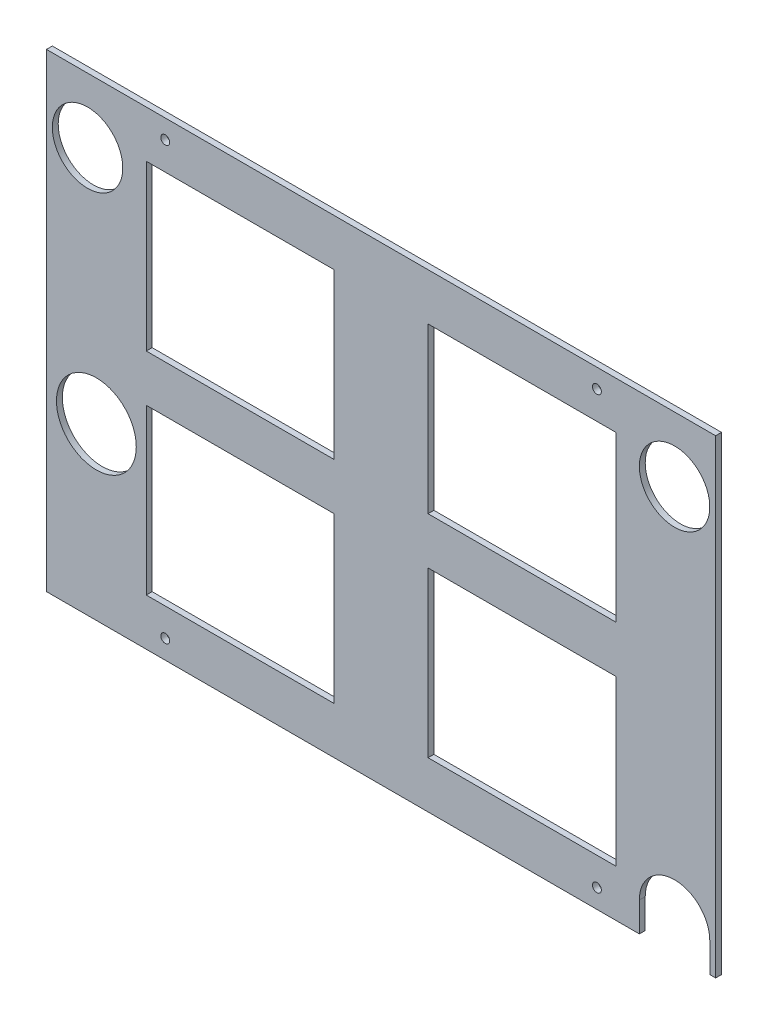
ISO-10303-21;
HEADER;
FILE_DESCRIPTION(('STEP AP214'),'2;1');
FILE_NAME('part.step','',(''),(''),'','','');
FILE_SCHEMA(('AUTOMOTIVE_DESIGN { 1 0 10303 214 1 1 1 1 }'));
ENDSEC;
DATA;
#1=APPLICATION_CONTEXT('core data for automotive mechanical design processes');
#2=APPLICATION_PROTOCOL_DEFINITION('international standard','automotive_design',2000,#1);
#3=PRODUCT_CONTEXT('',#1,'mechanical');
#4=PRODUCT('Part','Part','',(#3));
#5=PRODUCT_RELATED_PRODUCT_CATEGORY('part','',(#4));
#6=PRODUCT_DEFINITION_FORMATION('','',#4);
#7=PRODUCT_DEFINITION_CONTEXT('part definition',#1,'design');
#8=PRODUCT_DEFINITION('design','',#6,#7);
#9=PRODUCT_DEFINITION_SHAPE('','',#8);
#10=(LENGTH_UNIT() NAMED_UNIT(*) SI_UNIT(.MILLI.,.METRE.));
#11=(NAMED_UNIT(*) PLANE_ANGLE_UNIT() SI_UNIT($,.RADIAN.));
#12=(NAMED_UNIT(*) SI_UNIT($,.STERADIAN.) SOLID_ANGLE_UNIT());
#13=UNCERTAINTY_MEASURE_WITH_UNIT(LENGTH_MEASURE(1.E-05),#10,'distance_accuracy_value','');
#14=(GEOMETRIC_REPRESENTATION_CONTEXT(3) GLOBAL_UNCERTAINTY_ASSIGNED_CONTEXT((#13)) GLOBAL_UNIT_ASSIGNED_CONTEXT((#10,
#11,#12)) REPRESENTATION_CONTEXT('',''));
#15=CARTESIAN_POINT('',(0.,0.,0.));
#16=DIRECTION('',(0.,0.,1.));
#17=DIRECTION('',(1.,0.,0.));
#18=AXIS2_PLACEMENT_3D('',#15,#16,#17);
#19=CARTESIAN_POINT('',(339.725,15.875,0.));
#20=DIRECTION('',(0.,0.,1.));
#21=DIRECTION('',(1.,0.,0.));
#22=AXIS2_PLACEMENT_3D('',#19,#20,#21);
#23=PLANE('',#22);
#24=CARTESIAN_POINT('',(339.725,219.075,0.));
#25=DIRECTION('',(0.,0.,-1.));
#26=DIRECTION('',(-1.,0.,0.));
#27=AXIS2_PLACEMENT_3D('',#24,#25,#26);
#28=CIRCLE('',#27,19.05);
#29=CARTESIAN_POINT('',(320.675,219.075,0.));
#30=VERTEX_POINT('',#29);
#31=EDGE_CURVE('E283',#30,#30,#28,.F.);
#32=ORIENTED_EDGE('',*,*,#31,.T.);
#33=EDGE_LOOP('',(#32));
#34=FACE_BOUND('',#33,.T.);
#35=CARTESIAN_POINT('',(22.225,219.075,0.));
#36=DIRECTION('',(0.,0.,-1.));
#37=DIRECTION('',(-1.,0.,0.));
#38=AXIS2_PLACEMENT_3D('',#35,#36,#37);
#39=CIRCLE('',#38,19.05);
#40=CARTESIAN_POINT('',(3.17499999999998,219.075,0.));
#41=VERTEX_POINT('',#40);
#42=EDGE_CURVE('E243',#41,#41,#39,.F.);
#43=ORIENTED_EDGE('',*,*,#42,.T.);
#44=EDGE_LOOP('',(#43));
#45=FACE_BOUND('',#44,.T.);
#46=DIRECTION('',(1.,0.,0.));
#47=VECTOR('',#46,1.);
#48=CARTESIAN_POINT('',(206.375,25.4,0.));
#49=LINE('',#48,#47);
#50=CARTESIAN_POINT('',(307.975,25.4,0.));
#51=VERTEX_POINT('',#50);
#52=CARTESIAN_POINT('',(206.375,25.4,0.));
#53=VERTEX_POINT('',#52);
#54=EDGE_CURVE('E662',#51,#53,#49,.F.);
#55=ORIENTED_EDGE('',*,*,#54,.F.);
#56=DIRECTION('',(0.,1.,0.));
#57=VECTOR('',#56,1.);
#58=CARTESIAN_POINT('',(307.975,114.3,0.));
#59=LINE('',#58,#57);
#60=CARTESIAN_POINT('',(307.975,114.3,0.));
#61=VERTEX_POINT('',#60);
#62=EDGE_CURVE('E749',#61,#51,#59,.F.);
#63=ORIENTED_EDGE('',*,*,#62,.F.);
#64=DIRECTION('',(1.,0.,0.));
#65=VECTOR('',#64,1.);
#66=CARTESIAN_POINT('',(206.375,114.3,0.));
#67=LINE('',#66,#65);
#68=CARTESIAN_POINT('',(206.375,114.3,0.));
#69=VERTEX_POINT('',#68);
#70=EDGE_CURVE('E755',#69,#61,#67,.T.);
#71=ORIENTED_EDGE('',*,*,#70,.F.);
#72=DIRECTION('',(0.,1.,0.));
#73=VECTOR('',#72,1.);
#74=CARTESIAN_POINT('',(206.375,114.3,0.));
#75=LINE('',#74,#73);
#76=EDGE_CURVE('E760',#53,#69,#75,.T.);
#77=ORIENTED_EDGE('',*,*,#76,.F.);
#78=EDGE_LOOP('',(#55,#63,#71,#77));
#79=FACE_BOUND('',#78,.T.);
#80=DIRECTION('',(1.,0.,0.));
#81=VECTOR('',#80,1.);
#82=CARTESIAN_POINT('',(206.375,139.7,0.));
#83=LINE('',#82,#81);
#84=CARTESIAN_POINT('',(307.975,139.7,0.));
#85=VERTEX_POINT('',#84);
#86=CARTESIAN_POINT('',(206.375,139.7,0.));
#87=VERTEX_POINT('',#86);
#88=EDGE_CURVE('E665',#85,#87,#83,.F.);
#89=ORIENTED_EDGE('',*,*,#88,.F.);
#90=DIRECTION('',(0.,1.,0.));
#91=VECTOR('',#90,1.);
#92=CARTESIAN_POINT('',(307.975,228.6,0.));
#93=LINE('',#92,#91);
#94=CARTESIAN_POINT('',(307.975,228.6,0.));
#95=VERTEX_POINT('',#94);
#96=EDGE_CURVE('E668',#95,#85,#93,.F.);
#97=ORIENTED_EDGE('',*,*,#96,.F.);
#98=DIRECTION('',(1.,0.,0.));
#99=VECTOR('',#98,1.);
#100=CARTESIAN_POINT('',(206.375,228.6,0.));
#101=LINE('',#100,#99);
#102=CARTESIAN_POINT('',(206.375,228.6,0.));
#103=VERTEX_POINT('',#102);
#104=EDGE_CURVE('E687',#103,#95,#101,.T.);
#105=ORIENTED_EDGE('',*,*,#104,.F.);
#106=DIRECTION('',(0.,1.,0.));
#107=VECTOR('',#106,1.);
#108=CARTESIAN_POINT('',(206.375,228.6,0.));
#109=LINE('',#108,#107);
#110=EDGE_CURVE('E671',#87,#103,#109,.T.);
#111=ORIENTED_EDGE('',*,*,#110,.F.);
#112=EDGE_LOOP('',(#89,#97,#105,#111));
#113=FACE_BOUND('',#112,.T.);
#114=DIRECTION('',(1.,0.,0.));
#115=VECTOR('',#114,1.);
#116=CARTESIAN_POINT('',(0.,254.,0.));
#117=LINE('',#116,#115);
#118=CARTESIAN_POINT('',(0.,254.,0.));
#119=VERTEX_POINT('',#118);
#120=CARTESIAN_POINT('',(361.95,254.,0.));
#121=VERTEX_POINT('',#120);
#122=EDGE_CURVE('E231',#119,#121,#117,.T.);
#123=ORIENTED_EDGE('',*,*,#122,.T.);
#124=DIRECTION('',(0.,1.,0.));
#125=VECTOR('',#124,1.);
#126=CARTESIAN_POINT('',(361.95,0.,0.));
#127=LINE('',#126,#125);
#128=CARTESIAN_POINT('',(361.95,0.,0.));
#129=VERTEX_POINT('',#128);
#130=EDGE_CURVE('E718',#121,#129,#127,.F.);
#131=ORIENTED_EDGE('',*,*,#130,.T.);
#132=DIRECTION('',(1.,0.,0.));
#133=VECTOR('',#132,1.);
#134=CARTESIAN_POINT('',(358.775,0.,0.));
#135=LINE('',#134,#133);
#136=CARTESIAN_POINT('',(358.775,0.,0.));
#137=VERTEX_POINT('',#136);
#138=EDGE_CURVE('E254',#129,#137,#135,.F.);
#139=ORIENTED_EDGE('',*,*,#138,.T.);
#140=DIRECTION('',(0.,1.,0.));
#141=VECTOR('',#140,1.);
#142=CARTESIAN_POINT('',(358.775,0.,0.));
#143=LINE('',#142,#141);
#144=CARTESIAN_POINT('',(358.775,15.875,0.));
#145=VERTEX_POINT('',#144);
#146=EDGE_CURVE('E194',#137,#145,#143,.T.);
#147=ORIENTED_EDGE('',*,*,#146,.T.);
#148=CARTESIAN_POINT('',(339.725,15.875,0.));
#149=DIRECTION('',(0.,0.,-1.));
#150=DIRECTION('',(-1.,0.,0.));
#151=AXIS2_PLACEMENT_3D('',#148,#149,#150);
#152=CIRCLE('',#151,19.05);
#153=CARTESIAN_POINT('',(320.675,15.875,0.));
#154=VERTEX_POINT('',#153);
#155=EDGE_CURVE('E176',#145,#154,#152,.F.);
#156=ORIENTED_EDGE('',*,*,#155,.T.);
#157=DIRECTION('',(0.,1.,0.));
#158=VECTOR('',#157,1.);
#159=CARTESIAN_POINT('',(320.675,0.,0.));
#160=LINE('',#159,#158);
#161=CARTESIAN_POINT('',(320.675,0.,0.));
#162=VERTEX_POINT('',#161);
#163=EDGE_CURVE('E182',#154,#162,#160,.F.);
#164=ORIENTED_EDGE('',*,*,#163,.T.);
#165=DIRECTION('',(1.,0.,0.));
#166=VECTOR('',#165,1.);
#167=CARTESIAN_POINT('',(0.,0.,0.));
#168=LINE('',#167,#166);
#169=CARTESIAN_POINT('',(0.,0.,0.));
#170=VERTEX_POINT('',#169);
#171=EDGE_CURVE('E208',#162,#170,#168,.F.);
#172=ORIENTED_EDGE('',*,*,#171,.T.);
#173=DIRECTION('',(0.,1.,0.));
#174=VECTOR('',#173,1.);
#175=CARTESIAN_POINT('',(0.,0.,0.));
#176=LINE('',#175,#174);
#177=EDGE_CURVE('E220',#170,#119,#176,.T.);
#178=ORIENTED_EDGE('',*,*,#177,.T.);
#179=EDGE_LOOP('',(#123,#131,#139,#147,#156,#164,#172,#178));
#180=FACE_BOUND('',#179,.T.);
#181=DIRECTION('',(1.,0.,0.));
#182=VECTOR('',#181,1.);
#183=CARTESIAN_POINT('',(53.975,139.7,0.));
#184=LINE('',#183,#182);
#185=CARTESIAN_POINT('',(155.575,139.7,0.));
#186=VERTEX_POINT('',#185);
#187=CARTESIAN_POINT('',(53.975,139.7,0.));
#188=VERTEX_POINT('',#187);
#189=EDGE_CURVE('E247',#186,#188,#184,.F.);
#190=ORIENTED_EDGE('',*,*,#189,.F.);
#191=DIRECTION('',(0.,1.,0.));
#192=VECTOR('',#191,1.);
#193=CARTESIAN_POINT('',(155.575,228.6,0.));
#194=LINE('',#193,#192);
#195=CARTESIAN_POINT('',(155.575,228.6,0.));
#196=VERTEX_POINT('',#195);
#197=EDGE_CURVE('E700',#196,#186,#194,.F.);
#198=ORIENTED_EDGE('',*,*,#197,.F.);
#199=DIRECTION('',(1.,0.,0.));
#200=VECTOR('',#199,1.);
#201=CARTESIAN_POINT('',(53.975,228.6,0.));
#202=LINE('',#201,#200);
#203=CARTESIAN_POINT('',(53.975,228.6,0.));
#204=VERTEX_POINT('',#203);
#205=EDGE_CURVE('E706',#204,#196,#202,.T.);
#206=ORIENTED_EDGE('',*,*,#205,.F.);
#207=DIRECTION('',(0.,1.,0.));
#208=VECTOR('',#207,1.);
#209=CARTESIAN_POINT('',(53.975,228.6,0.));
#210=LINE('',#209,#208);
#211=EDGE_CURVE('E712',#188,#204,#210,.T.);
#212=ORIENTED_EDGE('',*,*,#211,.F.);
#213=EDGE_LOOP('',(#190,#198,#206,#212));
#214=FACE_BOUND('',#213,.T.);
#215=DIRECTION('',(1.,0.,0.));
#216=VECTOR('',#215,1.);
#217=CARTESIAN_POINT('',(155.575,114.3,0.));
#218=LINE('',#217,#216);
#219=CARTESIAN_POINT('',(53.975,114.3,0.));
#220=VERTEX_POINT('',#219);
#221=CARTESIAN_POINT('',(155.575,114.3,0.));
#222=VERTEX_POINT('',#221);
#223=EDGE_CURVE('E785',#220,#222,#218,.T.);
#224=ORIENTED_EDGE('',*,*,#223,.F.);
#225=DIRECTION('',(0.,1.,0.));
#226=VECTOR('',#225,1.);
#227=CARTESIAN_POINT('',(53.975,25.4,0.));
#228=LINE('',#227,#226);
#229=CARTESIAN_POINT('',(53.975,25.4,0.));
#230=VERTEX_POINT('',#229);
#231=EDGE_CURVE('E770',#230,#220,#228,.T.);
#232=ORIENTED_EDGE('',*,*,#231,.F.);
#233=DIRECTION('',(-1.,0.,0.));
#234=VECTOR('',#233,1.);
#235=CARTESIAN_POINT('',(155.575,25.4,0.));
#236=LINE('',#235,#234);
#237=CARTESIAN_POINT('',(155.575,25.4,0.));
#238=VERTEX_POINT('',#237);
#239=EDGE_CURVE('E776',#238,#230,#236,.T.);
#240=ORIENTED_EDGE('',*,*,#239,.F.);
#241=DIRECTION('',(0.,1.,0.));
#242=VECTOR('',#241,1.);
#243=CARTESIAN_POINT('',(155.575,25.4,0.));
#244=LINE('',#243,#242);
#245=EDGE_CURVE('E782',#222,#238,#244,.F.);
#246=ORIENTED_EDGE('',*,*,#245,.F.);
#247=EDGE_LOOP('',(#224,#232,#240,#246));
#248=FACE_BOUND('',#247,.T.);
#249=CARTESIAN_POINT('',(64.2316704261008,243.743329573899,0.));
#250=DIRECTION('',(0.,0.,1.));
#251=DIRECTION('',(1.,0.,0.));
#252=AXIS2_PLACEMENT_3D('',#249,#250,#251);
#253=CIRCLE('',#252,2.40030000000004);
#254=CARTESIAN_POINT('',(66.6319704261009,243.743329573899,0.));
#255=VERTEX_POINT('',#254);
#256=EDGE_CURVE('E288',#255,#255,#253,.T.);
#257=ORIENTED_EDGE('',*,*,#256,.T.);
#258=EDGE_LOOP('',(#257));
#259=FACE_BOUND('',#258,.T.);
#260=CARTESIAN_POINT('',(297.718329573899,10.2566704261012,0.));
#261=DIRECTION('',(0.,0.,1.));
#262=DIRECTION('',(1.,0.,0.));
#263=AXIS2_PLACEMENT_3D('',#260,#261,#262);
#264=CIRCLE('',#263,2.40030000000002);
#265=CARTESIAN_POINT('',(300.118629573899,10.2566704261012,0.));
#266=VERTEX_POINT('',#265);
#267=EDGE_CURVE('E291',#266,#266,#264,.T.);
#268=ORIENTED_EDGE('',*,*,#267,.T.);
#269=EDGE_LOOP('',(#268));
#270=FACE_BOUND('',#269,.T.);
#271=CARTESIAN_POINT('',(64.2316704261009,10.2566704261012,0.));
#272=DIRECTION('',(0.,0.,1.));
#273=DIRECTION('',(1.,0.,0.));
#274=AXIS2_PLACEMENT_3D('',#271,#272,#273);
#275=CIRCLE('',#274,2.40030000000002);
#276=CARTESIAN_POINT('',(66.6319704261009,10.2566704261012,0.));
#277=VERTEX_POINT('',#276);
#278=EDGE_CURVE('E294',#277,#277,#275,.T.);
#279=ORIENTED_EDGE('',*,*,#278,.T.);
#280=EDGE_LOOP('',(#279));
#281=FACE_BOUND('',#280,.T.);
#282=CARTESIAN_POINT('',(297.718329573899,243.743329573899,0.));
#283=DIRECTION('',(0.,0.,1.));
#284=DIRECTION('',(1.,0.,0.));
#285=AXIS2_PLACEMENT_3D('',#282,#283,#284);
#286=CIRCLE('',#285,2.40030000000002);
#287=CARTESIAN_POINT('',(300.118629573899,243.743329573899,0.));
#288=VERTEX_POINT('',#287);
#289=EDGE_CURVE('E296',#288,#288,#286,.T.);
#290=ORIENTED_EDGE('',*,*,#289,.T.);
#291=EDGE_LOOP('',(#290));
#292=FACE_BOUND('',#291,.T.);
#293=CARTESIAN_POINT('',(26.9875,92.075,0.));
#294=DIRECTION('',(0.,0.,1.));
#295=DIRECTION('',(1.,0.,0.));
#296=AXIS2_PLACEMENT_3D('',#293,#294,#295);
#297=CIRCLE('',#296,21.59);
#298=CARTESIAN_POINT('',(48.5775,92.075,0.));
#299=VERTEX_POINT('',#298);
#300=EDGE_CURVE('E20',#299,#299,#297,.T.);
#301=ORIENTED_EDGE('',*,*,#300,.T.);
#302=EDGE_LOOP('',(#301));
#303=FACE_BOUND('',#302,.T.);
#304=ADVANCED_FACE('F17',(#34,#45,#79,#113,#180,#214,#248,#259,#270,#281,#292,#303),#23,.F.);
#305=CARTESIAN_POINT('',(26.9875,92.075,-15.875));
#306=DIRECTION('',(0.,0.,1.));
#307=DIRECTION('',(1.,0.,0.));
#308=AXIS2_PLACEMENT_3D('',#305,#306,#307);
#309=CYLINDRICAL_SURFACE('',#308,21.59);
#310=CARTESIAN_POINT('',(26.9875,92.075,3.175));
#311=DIRECTION('',(0.,0.,1.));
#312=DIRECTION('',(1.,0.,0.));
#313=AXIS2_PLACEMENT_3D('',#310,#311,#312);
#314=CIRCLE('',#313,21.59);
#315=CARTESIAN_POINT('',(48.5775,92.075,3.175));
#316=VERTEX_POINT('',#315);
#317=EDGE_CURVE('E280',#316,#316,#314,.F.);
#318=ORIENTED_EDGE('',*,*,#317,.F.);
#319=EDGE_LOOP('',(#318));
#320=FACE_BOUND('',#319,.T.);
#321=ORIENTED_EDGE('',*,*,#300,.F.);
#322=EDGE_LOOP('',(#321));
#323=FACE_BOUND('',#322,.T.);
#324=ADVANCED_FACE('F304',(#320,#323),#309,.F.);
#325=CARTESIAN_POINT('',(297.718329573899,243.743329573899,-327.025));
#326=DIRECTION('',(0.,0.,1.));
#327=DIRECTION('',(1.,0.,0.));
#328=AXIS2_PLACEMENT_3D('',#325,#326,#327);
#329=CYLINDRICAL_SURFACE('',#328,2.40030000000002);
#330=CARTESIAN_POINT('',(297.718329573899,243.743329573899,3.17499999999998));
#331=DIRECTION('',(0.,0.,1.));
#332=DIRECTION('',(1.,0.,0.));
#333=AXIS2_PLACEMENT_3D('',#330,#331,#332);
#334=CIRCLE('',#333,2.40030000000002);
#335=CARTESIAN_POINT('',(300.118629573899,243.743329573899,3.17499999999998));
#336=VERTEX_POINT('',#335);
#337=EDGE_CURVE('E277',#336,#336,#334,.F.);
#338=ORIENTED_EDGE('',*,*,#337,.F.);
#339=EDGE_LOOP('',(#338));
#340=FACE_BOUND('',#339,.T.);
#341=ORIENTED_EDGE('',*,*,#289,.F.);
#342=EDGE_LOOP('',(#341));
#343=FACE_BOUND('',#342,.T.);
#344=ADVANCED_FACE('F306',(#340,#343),#329,.F.);
#345=CARTESIAN_POINT('',(64.2316704261009,10.2566704261012,-327.025));
#346=DIRECTION('',(0.,0.,1.));
#347=DIRECTION('',(1.,0.,0.));
#348=AXIS2_PLACEMENT_3D('',#345,#346,#347);
#349=CYLINDRICAL_SURFACE('',#348,2.40030000000002);
#350=CARTESIAN_POINT('',(64.2316704261009,10.2566704261012,3.17499999999998));
#351=DIRECTION('',(0.,0.,1.));
#352=DIRECTION('',(1.,0.,0.));
#353=AXIS2_PLACEMENT_3D('',#350,#351,#352);
#354=CIRCLE('',#353,2.40030000000002);
#355=CARTESIAN_POINT('',(66.6319704261009,10.2566704261012,3.17499999999998));
#356=VERTEX_POINT('',#355);
#357=EDGE_CURVE('E274',#356,#356,#354,.F.);
#358=ORIENTED_EDGE('',*,*,#357,.F.);
#359=EDGE_LOOP('',(#358));
#360=FACE_BOUND('',#359,.T.);
#361=ORIENTED_EDGE('',*,*,#278,.F.);
#362=EDGE_LOOP('',(#361));
#363=FACE_BOUND('',#362,.T.);
#364=ADVANCED_FACE('F313',(#360,#363),#349,.F.);
#365=CARTESIAN_POINT('',(297.718329573899,10.2566704261012,-327.025));
#366=DIRECTION('',(0.,0.,1.));
#367=DIRECTION('',(1.,0.,0.));
#368=AXIS2_PLACEMENT_3D('',#365,#366,#367);
#369=CYLINDRICAL_SURFACE('',#368,2.40030000000002);
#370=CARTESIAN_POINT('',(297.718329573899,10.2566704261012,3.17499999999998));
#371=DIRECTION('',(0.,0.,1.));
#372=DIRECTION('',(1.,0.,0.));
#373=AXIS2_PLACEMENT_3D('',#370,#371,#372);
#374=CIRCLE('',#373,2.40030000000002);
#375=CARTESIAN_POINT('',(300.118629573899,10.2566704261012,3.17499999999998));
#376=VERTEX_POINT('',#375);
#377=EDGE_CURVE('E271',#376,#376,#374,.F.);
#378=ORIENTED_EDGE('',*,*,#377,.F.);
#379=EDGE_LOOP('',(#378));
#380=FACE_BOUND('',#379,.T.);
#381=ORIENTED_EDGE('',*,*,#267,.F.);
#382=EDGE_LOOP('',(#381));
#383=FACE_BOUND('',#382,.T.);
#384=ADVANCED_FACE('F428',(#380,#383),#369,.F.);
#385=CARTESIAN_POINT('',(64.2316704261008,243.743329573899,-327.025));
#386=DIRECTION('',(0.,0.,1.));
#387=DIRECTION('',(1.,0.,0.));
#388=AXIS2_PLACEMENT_3D('',#385,#386,#387);
#389=CYLINDRICAL_SURFACE('',#388,2.40030000000004);
#390=CARTESIAN_POINT('',(64.2316704261008,243.743329573899,3.17499999999998));
#391=DIRECTION('',(0.,0.,1.));
#392=DIRECTION('',(1.,0.,0.));
#393=AXIS2_PLACEMENT_3D('',#390,#391,#392);
#394=CIRCLE('',#393,2.40030000000004);
#395=CARTESIAN_POINT('',(66.6319704261009,243.743329573899,3.17499999999998));
#396=VERTEX_POINT('',#395);
#397=EDGE_CURVE('E268',#396,#396,#394,.F.);
#398=ORIENTED_EDGE('',*,*,#397,.F.);
#399=EDGE_LOOP('',(#398));
#400=FACE_BOUND('',#399,.T.);
#401=ORIENTED_EDGE('',*,*,#256,.F.);
#402=EDGE_LOOP('',(#401));
#403=FACE_BOUND('',#402,.T.);
#404=ADVANCED_FACE('F424',(#400,#403),#389,.F.);
#405=CARTESIAN_POINT('',(22.225,219.075,3.175));
#406=DIRECTION('',(0.,0.,-1.));
#407=DIRECTION('',(-1.,0.,0.));
#408=AXIS2_PLACEMENT_3D('',#405,#406,#407);
#409=CYLINDRICAL_SURFACE('',#408,19.05);
#410=CARTESIAN_POINT('',(22.225,219.075,3.175));
#411=DIRECTION('',(0.,0.,-1.));
#412=DIRECTION('',(-1.,0.,0.));
#413=AXIS2_PLACEMENT_3D('',#410,#411,#412);
#414=CIRCLE('',#413,19.05);
#415=CARTESIAN_POINT('',(3.17499999999998,219.075,3.175));
#416=VERTEX_POINT('',#415);
#417=EDGE_CURVE('E225',#416,#416,#414,.T.);
#418=ORIENTED_EDGE('',*,*,#417,.F.);
#419=EDGE_LOOP('',(#418));
#420=FACE_BOUND('',#419,.T.);
#421=ORIENTED_EDGE('',*,*,#42,.F.);
#422=EDGE_LOOP('',(#421));
#423=FACE_BOUND('',#422,.T.);
#424=ADVANCED_FACE('F420',(#420,#423),#409,.F.);
#425=CARTESIAN_POINT('',(0.,0.,3.175));
#426=DIRECTION('',(1.,0.,0.));
#427=DIRECTION('',(0.,0.,-1.));
#428=AXIS2_PLACEMENT_3D('',#425,#426,#427);
#429=PLANE('',#428);
#430=DIRECTION('',(0.,0.,1.));
#431=VECTOR('',#430,1.);
#432=CARTESIAN_POINT('',(0.,0.,3.175));
#433=LINE('',#432,#431);
#434=CARTESIAN_POINT('',(0.,0.,3.175));
#435=VERTEX_POINT('',#434);
#436=EDGE_CURVE('E218',#170,#435,#433,.T.);
#437=ORIENTED_EDGE('',*,*,#436,.T.);
#438=DIRECTION('',(0.,1.,0.));
#439=VECTOR('',#438,1.);
#440=CARTESIAN_POINT('',(0.,15.875,3.175));
#441=LINE('',#440,#439);
#442=CARTESIAN_POINT('',(0.,254.,3.175));
#443=VERTEX_POINT('',#442);
#444=EDGE_CURVE('E215',#443,#435,#441,.F.);
#445=ORIENTED_EDGE('',*,*,#444,.F.);
#446=DIRECTION('',(0.,0.,-1.));
#447=VECTOR('',#446,1.);
#448=CARTESIAN_POINT('',(0.,254.,3.175));
#449=LINE('',#448,#447);
#450=EDGE_CURVE('E228',#443,#119,#449,.T.);
#451=ORIENTED_EDGE('',*,*,#450,.T.);
#452=ORIENTED_EDGE('',*,*,#177,.F.);
#453=EDGE_LOOP('',(#437,#445,#451,#452));
#454=FACE_BOUND('',#453,.T.);
#455=ADVANCED_FACE('F416',(#454),#429,.F.);
#456=CARTESIAN_POINT('',(0.,0.,3.175));
#457=DIRECTION('',(0.,1.,0.));
#458=DIRECTION('',(0.,0.,1.));
#459=AXIS2_PLACEMENT_3D('',#456,#457,#458);
#460=PLANE('',#459);
#461=DIRECTION('',(0.,0.,1.));
#462=VECTOR('',#461,1.);
#463=CARTESIAN_POINT('',(320.675,0.,3.175));
#464=LINE('',#463,#462);
#465=CARTESIAN_POINT('',(320.675,0.,3.175));
#466=VERTEX_POINT('',#465);
#467=EDGE_CURVE('E187',#162,#466,#464,.T.);
#468=ORIENTED_EDGE('',*,*,#467,.T.);
#469=DIRECTION('',(1.,0.,0.));
#470=VECTOR('',#469,1.);
#471=CARTESIAN_POINT('',(339.725,0.,3.175));
#472=LINE('',#471,#470);
#473=EDGE_CURVE('E211',#435,#466,#472,.T.);
#474=ORIENTED_EDGE('',*,*,#473,.F.);
#475=ORIENTED_EDGE('',*,*,#436,.F.);
#476=ORIENTED_EDGE('',*,*,#171,.F.);
#477=EDGE_LOOP('',(#468,#474,#475,#476));
#478=FACE_BOUND('',#477,.T.);
#479=ADVANCED_FACE('F413',(#478),#460,.F.);
#480=CARTESIAN_POINT('',(320.675,0.,3.175));
#481=DIRECTION('',(-1.,0.,0.));
#482=DIRECTION('',(0.,0.,1.));
#483=AXIS2_PLACEMENT_3D('',#480,#481,#482);
#484=PLANE('',#483);
#485=DIRECTION('',(0.,0.,-1.));
#486=VECTOR('',#485,1.);
#487=CARTESIAN_POINT('',(320.675,15.875,3.175));
#488=LINE('',#487,#486);
#489=CARTESIAN_POINT('',(320.675,15.875,3.175));
#490=VERTEX_POINT('',#489);
#491=EDGE_CURVE('E185',#154,#490,#488,.F.);
#492=ORIENTED_EDGE('',*,*,#491,.T.);
#493=DIRECTION('',(0.,1.,0.));
#494=VECTOR('',#493,1.);
#495=CARTESIAN_POINT('',(320.675,15.875,3.175));
#496=LINE('',#495,#494);
#497=EDGE_CURVE('E214',#466,#490,#496,.T.);
#498=ORIENTED_EDGE('',*,*,#497,.F.);
#499=ORIENTED_EDGE('',*,*,#467,.F.);
#500=ORIENTED_EDGE('',*,*,#163,.F.);
#501=EDGE_LOOP('',(#492,#498,#499,#500));
#502=FACE_BOUND('',#501,.T.);
#503=ADVANCED_FACE('F183',(#502),#484,.F.);
#504=CARTESIAN_POINT('',(339.725,15.875,3.175));
#505=DIRECTION('',(0.,0.,-1.));
#506=DIRECTION('',(-1.,0.,0.));
#507=AXIS2_PLACEMENT_3D('',#504,#505,#506);
#508=CYLINDRICAL_SURFACE('',#507,19.05);
#509=DIRECTION('',(0.,0.,-1.));
#510=VECTOR('',#509,1.);
#511=CARTESIAN_POINT('',(358.775,15.875,3.175));
#512=LINE('',#511,#510);
#513=CARTESIAN_POINT('',(358.775,15.875,3.175));
#514=VERTEX_POINT('',#513);
#515=EDGE_CURVE('E196',#145,#514,#512,.F.);
#516=ORIENTED_EDGE('',*,*,#515,.T.);
#517=CARTESIAN_POINT('',(339.725,15.875,3.175));
#518=DIRECTION('',(0.,0.,-1.));
#519=DIRECTION('',(-1.,0.,0.));
#520=AXIS2_PLACEMENT_3D('',#517,#518,#519);
#521=CIRCLE('',#520,19.05);
#522=EDGE_CURVE('E200',#490,#514,#521,.T.);
#523=ORIENTED_EDGE('',*,*,#522,.F.);
#524=ORIENTED_EDGE('',*,*,#491,.F.);
#525=ORIENTED_EDGE('',*,*,#155,.F.);
#526=EDGE_LOOP('',(#516,#523,#524,#525));
#527=FACE_BOUND('',#526,.T.);
#528=ADVANCED_FACE('F198',(#527),#508,.F.);
#529=CARTESIAN_POINT('',(358.775,0.,3.175));
#530=DIRECTION('',(1.,0.,0.));
#531=DIRECTION('',(0.,0.,-1.));
#532=AXIS2_PLACEMENT_3D('',#529,#530,#531);
#533=PLANE('',#532);
#534=DIRECTION('',(0.,0.,1.));
#535=VECTOR('',#534,1.);
#536=CARTESIAN_POINT('',(358.775,0.,3.175));
#537=LINE('',#536,#535);
#538=CARTESIAN_POINT('',(358.775,0.,3.175));
#539=VERTEX_POINT('',#538);
#540=EDGE_CURVE('E251',#137,#539,#537,.T.);
#541=ORIENTED_EDGE('',*,*,#540,.T.);
#542=DIRECTION('',(0.,1.,0.));
#543=VECTOR('',#542,1.);
#544=CARTESIAN_POINT('',(358.775,15.875,3.175));
#545=LINE('',#544,#543);
#546=EDGE_CURVE('E265',#514,#539,#545,.F.);
#547=ORIENTED_EDGE('',*,*,#546,.F.);
#548=ORIENTED_EDGE('',*,*,#515,.F.);
#549=ORIENTED_EDGE('',*,*,#146,.F.);
#550=EDGE_LOOP('',(#541,#547,#548,#549));
#551=FACE_BOUND('',#550,.T.);
#552=ADVANCED_FACE('F404',(#551),#533,.F.);
#553=CARTESIAN_POINT('',(358.775,0.,3.175));
#554=DIRECTION('',(0.,1.,0.));
#555=DIRECTION('',(0.,0.,1.));
#556=AXIS2_PLACEMENT_3D('',#553,#554,#555);
#557=PLANE('',#556);
#558=DIRECTION('',(0.,0.,1.));
#559=VECTOR('',#558,1.);
#560=CARTESIAN_POINT('',(361.95,0.,3.175));
#561=LINE('',#560,#559);
#562=CARTESIAN_POINT('',(361.95,0.,3.175));
#563=VERTEX_POINT('',#562);
#564=EDGE_CURVE('E256',#129,#563,#561,.T.);
#565=ORIENTED_EDGE('',*,*,#564,.T.);
#566=DIRECTION('',(1.,0.,0.));
#567=VECTOR('',#566,1.);
#568=CARTESIAN_POINT('',(339.725,0.,3.175));
#569=LINE('',#568,#567);
#570=EDGE_CURVE('E723',#539,#563,#569,.T.);
#571=ORIENTED_EDGE('',*,*,#570,.F.);
#572=ORIENTED_EDGE('',*,*,#540,.F.);
#573=ORIENTED_EDGE('',*,*,#138,.F.);
#574=EDGE_LOOP('',(#565,#571,#572,#573));
#575=FACE_BOUND('',#574,.T.);
#576=ADVANCED_FACE('F400',(#575),#557,.F.);
#577=CARTESIAN_POINT('',(361.95,0.,3.175));
#578=DIRECTION('',(-1.,0.,0.));
#579=DIRECTION('',(0.,0.,1.));
#580=AXIS2_PLACEMENT_3D('',#577,#578,#579);
#581=PLANE('',#580);
#582=DIRECTION('',(0.,0.,-1.));
#583=VECTOR('',#582,1.);
#584=CARTESIAN_POINT('',(361.95,254.,3.175));
#585=LINE('',#584,#583);
#586=CARTESIAN_POINT('',(361.95,254.,3.175));
#587=VERTEX_POINT('',#586);
#588=EDGE_CURVE('E232',#121,#587,#585,.F.);
#589=ORIENTED_EDGE('',*,*,#588,.T.);
#590=DIRECTION('',(0.,1.,0.));
#591=VECTOR('',#590,1.);
#592=CARTESIAN_POINT('',(361.95,15.875,3.175));
#593=LINE('',#592,#591);
#594=EDGE_CURVE('E239',#563,#587,#593,.T.);
#595=ORIENTED_EDGE('',*,*,#594,.F.);
#596=ORIENTED_EDGE('',*,*,#564,.F.);
#597=ORIENTED_EDGE('',*,*,#130,.F.);
#598=EDGE_LOOP('',(#589,#595,#596,#597));
#599=FACE_BOUND('',#598,.T.);
#600=ADVANCED_FACE('F396',(#599),#581,.F.);
#601=CARTESIAN_POINT('',(0.,254.,3.175));
#602=DIRECTION('',(0.,-1.,0.));
#603=DIRECTION('',(0.,0.,-1.));
#604=AXIS2_PLACEMENT_3D('',#601,#602,#603);
#605=PLANE('',#604);
#606=ORIENTED_EDGE('',*,*,#450,.F.);
#607=DIRECTION('',(1.,0.,0.));
#608=VECTOR('',#607,1.);
#609=CARTESIAN_POINT('',(339.725,254.,3.175));
#610=LINE('',#609,#608);
#611=EDGE_CURVE('E235',#587,#443,#610,.F.);
#612=ORIENTED_EDGE('',*,*,#611,.F.);
#613=ORIENTED_EDGE('',*,*,#588,.F.);
#614=ORIENTED_EDGE('',*,*,#122,.F.);
#615=EDGE_LOOP('',(#606,#612,#613,#614));
#616=FACE_BOUND('',#615,.T.);
#617=ADVANCED_FACE('F392',(#616),#605,.F.);
#618=CARTESIAN_POINT('',(53.975,139.7,3.175));
#619=DIRECTION('',(0.,1.,0.));
#620=DIRECTION('',(0.,0.,1.));
#621=AXIS2_PLACEMENT_3D('',#618,#619,#620);
#622=PLANE('',#621);
#623=DIRECTION('',(1.,0.,0.));
#624=VECTOR('',#623,1.);
#625=CARTESIAN_POINT('',(339.725,139.7,3.175));
#626=LINE('',#625,#624);
#627=CARTESIAN_POINT('',(155.575,139.7,3.175));
#628=VERTEX_POINT('',#627);
#629=CARTESIAN_POINT('',(53.975,139.7,3.175));
#630=VERTEX_POINT('',#629);
#631=EDGE_CURVE('E238',#628,#630,#626,.F.);
#632=ORIENTED_EDGE('',*,*,#631,.F.);
#633=DIRECTION('',(0.,0.,1.));
#634=VECTOR('',#633,1.);
#635=CARTESIAN_POINT('',(155.575,139.7,3.175));
#636=LINE('',#635,#634);
#637=EDGE_CURVE('E697',#186,#628,#636,.T.);
#638=ORIENTED_EDGE('',*,*,#637,.F.);
#639=ORIENTED_EDGE('',*,*,#189,.T.);
#640=DIRECTION('',(0.,0.,-1.));
#641=VECTOR('',#640,1.);
#642=CARTESIAN_POINT('',(53.975,139.7,3.175));
#643=LINE('',#642,#641);
#644=EDGE_CURVE('E709',#630,#188,#643,.T.);
#645=ORIENTED_EDGE('',*,*,#644,.F.);
#646=EDGE_LOOP('',(#632,#638,#639,#645));
#647=FACE_BOUND('',#646,.T.);
#648=ADVANCED_FACE('F388',(#647),#622,.T.);
#649=CARTESIAN_POINT('',(53.975,228.6,3.175));
#650=DIRECTION('',(1.,0.,0.));
#651=DIRECTION('',(0.,0.,-1.));
#652=AXIS2_PLACEMENT_3D('',#649,#650,#651);
#653=PLANE('',#652);
#654=DIRECTION('',(0.,1.,0.));
#655=VECTOR('',#654,1.);
#656=CARTESIAN_POINT('',(53.975,15.875,3.175));
#657=LINE('',#656,#655);
#658=CARTESIAN_POINT('',(53.975,228.6,3.175));
#659=VERTEX_POINT('',#658);
#660=EDGE_CURVE('E821',#630,#659,#657,.T.);
#661=ORIENTED_EDGE('',*,*,#660,.F.);
#662=ORIENTED_EDGE('',*,*,#644,.T.);
#663=ORIENTED_EDGE('',*,*,#211,.T.);
#664=DIRECTION('',(0.,0.,-1.));
#665=VECTOR('',#664,1.);
#666=CARTESIAN_POINT('',(53.975,228.6,3.175));
#667=LINE('',#666,#665);
#668=EDGE_CURVE('E703',#659,#204,#667,.T.);
#669=ORIENTED_EDGE('',*,*,#668,.F.);
#670=EDGE_LOOP('',(#661,#662,#663,#669));
#671=FACE_BOUND('',#670,.T.);
#672=ADVANCED_FACE('F384',(#671),#653,.T.);
#673=CARTESIAN_POINT('',(53.975,228.6,3.175));
#674=DIRECTION('',(0.,-1.,0.));
#675=DIRECTION('',(0.,0.,-1.));
#676=AXIS2_PLACEMENT_3D('',#673,#674,#675);
#677=PLANE('',#676);
#678=DIRECTION('',(1.,0.,0.));
#679=VECTOR('',#678,1.);
#680=CARTESIAN_POINT('',(339.725,228.6,3.175));
#681=LINE('',#680,#679);
#682=CARTESIAN_POINT('',(155.575,228.6,3.175));
#683=VERTEX_POINT('',#682);
#684=EDGE_CURVE('E818',#659,#683,#681,.T.);
#685=ORIENTED_EDGE('',*,*,#684,.F.);
#686=ORIENTED_EDGE('',*,*,#668,.T.);
#687=ORIENTED_EDGE('',*,*,#205,.T.);
#688=DIRECTION('',(0.,0.,1.));
#689=VECTOR('',#688,1.);
#690=CARTESIAN_POINT('',(155.575,228.6,3.175));
#691=LINE('',#690,#689);
#692=EDGE_CURVE('E673',#683,#196,#691,.F.);
#693=ORIENTED_EDGE('',*,*,#692,.F.);
#694=EDGE_LOOP('',(#685,#686,#687,#693));
#695=FACE_BOUND('',#694,.T.);
#696=ADVANCED_FACE('F380',(#695),#677,.T.);
#697=CARTESIAN_POINT('',(155.575,228.6,3.175));
#698=DIRECTION('',(-1.,0.,0.));
#699=DIRECTION('',(0.,0.,1.));
#700=AXIS2_PLACEMENT_3D('',#697,#698,#699);
#701=PLANE('',#700);
#702=DIRECTION('',(0.,1.,0.));
#703=VECTOR('',#702,1.);
#704=CARTESIAN_POINT('',(155.575,15.875,3.175));
#705=LINE('',#704,#703);
#706=EDGE_CURVE('E815',#683,#628,#705,.F.);
#707=ORIENTED_EDGE('',*,*,#706,.F.);
#708=ORIENTED_EDGE('',*,*,#692,.T.);
#709=ORIENTED_EDGE('',*,*,#197,.T.);
#710=ORIENTED_EDGE('',*,*,#637,.T.);
#711=EDGE_LOOP('',(#707,#708,#709,#710));
#712=FACE_BOUND('',#711,.T.);
#713=ADVANCED_FACE('F376',(#712),#701,.T.);
#714=CARTESIAN_POINT('',(206.375,139.7,3.175));
#715=DIRECTION('',(0.,1.,0.));
#716=DIRECTION('',(0.,0.,1.));
#717=AXIS2_PLACEMENT_3D('',#714,#715,#716);
#718=PLANE('',#717);
#719=DIRECTION('',(1.,0.,0.));
#720=VECTOR('',#719,1.);
#721=CARTESIAN_POINT('',(339.725,139.7,3.175));
#722=LINE('',#721,#720);
#723=CARTESIAN_POINT('',(307.975,139.7,3.175));
#724=VERTEX_POINT('',#723);
#725=CARTESIAN_POINT('',(206.375,139.7,3.175));
#726=VERTEX_POINT('',#725);
#727=EDGE_CURVE('E678',#724,#726,#722,.F.);
#728=ORIENTED_EDGE('',*,*,#727,.F.);
#729=DIRECTION('',(0.,0.,1.));
#730=VECTOR('',#729,1.);
#731=CARTESIAN_POINT('',(307.975,139.7,3.175));
#732=LINE('',#731,#730);
#733=EDGE_CURVE('E676',#85,#724,#732,.T.);
#734=ORIENTED_EDGE('',*,*,#733,.F.);
#735=ORIENTED_EDGE('',*,*,#88,.T.);
#736=DIRECTION('',(0.,0.,-1.));
#737=VECTOR('',#736,1.);
#738=CARTESIAN_POINT('',(206.375,139.7,3.175));
#739=LINE('',#738,#737);
#740=EDGE_CURVE('E692',#726,#87,#739,.T.);
#741=ORIENTED_EDGE('',*,*,#740,.F.);
#742=EDGE_LOOP('',(#728,#734,#735,#741));
#743=FACE_BOUND('',#742,.T.);
#744=ADVANCED_FACE('F372',(#743),#718,.T.);
#745=CARTESIAN_POINT('',(206.375,228.6,3.175));
#746=DIRECTION('',(1.,0.,0.));
#747=DIRECTION('',(0.,0.,-1.));
#748=AXIS2_PLACEMENT_3D('',#745,#746,#747);
#749=PLANE('',#748);
#750=DIRECTION('',(0.,1.,0.));
#751=VECTOR('',#750,1.);
#752=CARTESIAN_POINT('',(206.375,15.875,3.175));
#753=LINE('',#752,#751);
#754=CARTESIAN_POINT('',(206.375,228.6,3.175));
#755=VERTEX_POINT('',#754);
#756=EDGE_CURVE('E811',#726,#755,#753,.T.);
#757=ORIENTED_EDGE('',*,*,#756,.F.);
#758=ORIENTED_EDGE('',*,*,#740,.T.);
#759=ORIENTED_EDGE('',*,*,#110,.T.);
#760=DIRECTION('',(0.,0.,-1.));
#761=VECTOR('',#760,1.);
#762=CARTESIAN_POINT('',(206.375,228.6,3.175));
#763=LINE('',#762,#761);
#764=EDGE_CURVE('E684',#755,#103,#763,.T.);
#765=ORIENTED_EDGE('',*,*,#764,.F.);
#766=EDGE_LOOP('',(#757,#758,#759,#765));
#767=FACE_BOUND('',#766,.T.);
#768=ADVANCED_FACE('F368',(#767),#749,.T.);
#769=CARTESIAN_POINT('',(206.375,228.6,3.175));
#770=DIRECTION('',(0.,-1.,0.));
#771=DIRECTION('',(0.,0.,-1.));
#772=AXIS2_PLACEMENT_3D('',#769,#770,#771);
#773=PLANE('',#772);
#774=DIRECTION('',(1.,0.,0.));
#775=VECTOR('',#774,1.);
#776=CARTESIAN_POINT('',(339.725,228.6,3.175));
#777=LINE('',#776,#775);
#778=CARTESIAN_POINT('',(307.975,228.6,3.175));
#779=VERTEX_POINT('',#778);
#780=EDGE_CURVE('E805',#755,#779,#777,.T.);
#781=ORIENTED_EDGE('',*,*,#780,.F.);
#782=ORIENTED_EDGE('',*,*,#764,.T.);
#783=ORIENTED_EDGE('',*,*,#104,.T.);
#784=DIRECTION('',(0.,0.,1.));
#785=VECTOR('',#784,1.);
#786=CARTESIAN_POINT('',(307.975,228.6,3.175));
#787=LINE('',#786,#785);
#788=EDGE_CURVE('E681',#779,#95,#787,.F.);
#789=ORIENTED_EDGE('',*,*,#788,.F.);
#790=EDGE_LOOP('',(#781,#782,#783,#789));
#791=FACE_BOUND('',#790,.T.);
#792=ADVANCED_FACE('F364',(#791),#773,.T.);
#793=CARTESIAN_POINT('',(307.975,228.6,3.175));
#794=DIRECTION('',(-1.,0.,0.));
#795=DIRECTION('',(0.,0.,1.));
#796=AXIS2_PLACEMENT_3D('',#793,#794,#795);
#797=PLANE('',#796);
#798=DIRECTION('',(0.,1.,0.));
#799=VECTOR('',#798,1.);
#800=CARTESIAN_POINT('',(307.975,15.875,3.175));
#801=LINE('',#800,#799);
#802=EDGE_CURVE('E803',#779,#724,#801,.F.);
#803=ORIENTED_EDGE('',*,*,#802,.F.);
#804=ORIENTED_EDGE('',*,*,#788,.T.);
#805=ORIENTED_EDGE('',*,*,#96,.T.);
#806=ORIENTED_EDGE('',*,*,#733,.T.);
#807=EDGE_LOOP('',(#803,#804,#805,#806));
#808=FACE_BOUND('',#807,.T.);
#809=ADVANCED_FACE('F360',(#808),#797,.T.);
#810=CARTESIAN_POINT('',(155.575,114.3,3.175));
#811=DIRECTION('',(0.,-1.,0.));
#812=DIRECTION('',(0.,0.,-1.));
#813=AXIS2_PLACEMENT_3D('',#810,#811,#812);
#814=PLANE('',#813);
#815=DIRECTION('',(1.,0.,0.));
#816=VECTOR('',#815,1.);
#817=CARTESIAN_POINT('',(339.725,114.3,3.175));
#818=LINE('',#817,#816);
#819=CARTESIAN_POINT('',(53.975,114.3,3.175));
#820=VERTEX_POINT('',#819);
#821=CARTESIAN_POINT('',(155.575,114.3,3.175));
#822=VERTEX_POINT('',#821);
#823=EDGE_CURVE('E797',#820,#822,#818,.T.);
#824=ORIENTED_EDGE('',*,*,#823,.F.);
#825=DIRECTION('',(0.,0.,1.));
#826=VECTOR('',#825,1.);
#827=CARTESIAN_POINT('',(53.975,114.3,3.175));
#828=LINE('',#827,#826);
#829=EDGE_CURVE('E767',#220,#820,#828,.T.);
#830=ORIENTED_EDGE('',*,*,#829,.F.);
#831=ORIENTED_EDGE('',*,*,#223,.T.);
#832=DIRECTION('',(0.,0.,1.));
#833=VECTOR('',#832,1.);
#834=CARTESIAN_POINT('',(155.575,114.3,3.175));
#835=LINE('',#834,#833);
#836=EDGE_CURVE('E779',#822,#222,#835,.F.);
#837=ORIENTED_EDGE('',*,*,#836,.F.);
#838=EDGE_LOOP('',(#824,#830,#831,#837));
#839=FACE_BOUND('',#838,.T.);
#840=ADVANCED_FACE('F356',(#839),#814,.T.);
#841=CARTESIAN_POINT('',(155.575,25.4,3.175));
#842=DIRECTION('',(-1.,0.,0.));
#843=DIRECTION('',(0.,0.,1.));
#844=AXIS2_PLACEMENT_3D('',#841,#842,#843);
#845=PLANE('',#844);
#846=DIRECTION('',(0.,1.,0.));
#847=VECTOR('',#846,1.);
#848=CARTESIAN_POINT('',(155.575,15.875,3.175));
#849=LINE('',#848,#847);
#850=CARTESIAN_POINT('',(155.575,25.4,3.175));
#851=VERTEX_POINT('',#850);
#852=EDGE_CURVE('E791',#822,#851,#849,.F.);
#853=ORIENTED_EDGE('',*,*,#852,.F.);
#854=ORIENTED_EDGE('',*,*,#836,.T.);
#855=ORIENTED_EDGE('',*,*,#245,.T.);
#856=DIRECTION('',(0.,0.,1.));
#857=VECTOR('',#856,1.);
#858=CARTESIAN_POINT('',(155.575,25.4,3.175));
#859=LINE('',#858,#857);
#860=EDGE_CURVE('E773',#851,#238,#859,.F.);
#861=ORIENTED_EDGE('',*,*,#860,.F.);
#862=EDGE_LOOP('',(#853,#854,#855,#861));
#863=FACE_BOUND('',#862,.T.);
#864=ADVANCED_FACE('F352',(#863),#845,.T.);
#865=CARTESIAN_POINT('',(155.575,25.4,3.175));
#866=DIRECTION('',(0.,1.,0.));
#867=DIRECTION('',(-1.,0.,0.));
#868=AXIS2_PLACEMENT_3D('',#865,#866,#867);
#869=PLANE('',#868);
#870=DIRECTION('',(1.,0.,0.));
#871=VECTOR('',#870,1.);
#872=CARTESIAN_POINT('',(339.725,25.4,3.175));
#873=LINE('',#872,#871);
#874=CARTESIAN_POINT('',(53.975,25.4,3.175));
#875=VERTEX_POINT('',#874);
#876=EDGE_CURVE('E796',#851,#875,#873,.F.);
#877=ORIENTED_EDGE('',*,*,#876,.F.);
#878=ORIENTED_EDGE('',*,*,#860,.T.);
#879=ORIENTED_EDGE('',*,*,#239,.T.);
#880=DIRECTION('',(0.,0.,1.));
#881=VECTOR('',#880,1.);
#882=CARTESIAN_POINT('',(53.975,25.4,3.175));
#883=LINE('',#882,#881);
#884=EDGE_CURVE('E764',#875,#230,#883,.F.);
#885=ORIENTED_EDGE('',*,*,#884,.F.);
#886=EDGE_LOOP('',(#877,#878,#879,#885));
#887=FACE_BOUND('',#886,.T.);
#888=ADVANCED_FACE('F348',(#887),#869,.T.);
#889=CARTESIAN_POINT('',(53.975,25.4,3.175));
#890=DIRECTION('',(1.,0.,0.));
#891=DIRECTION('',(0.,1.,0.));
#892=AXIS2_PLACEMENT_3D('',#889,#890,#891);
#893=PLANE('',#892);
#894=DIRECTION('',(0.,1.,0.));
#895=VECTOR('',#894,1.);
#896=CARTESIAN_POINT('',(53.975,15.875,3.175));
#897=LINE('',#896,#895);
#898=EDGE_CURVE('E802',#875,#820,#897,.T.);
#899=ORIENTED_EDGE('',*,*,#898,.F.);
#900=ORIENTED_EDGE('',*,*,#884,.T.);
#901=ORIENTED_EDGE('',*,*,#231,.T.);
#902=ORIENTED_EDGE('',*,*,#829,.T.);
#903=EDGE_LOOP('',(#899,#900,#901,#902));
#904=FACE_BOUND('',#903,.T.);
#905=ADVANCED_FACE('F344',(#904),#893,.T.);
#906=CARTESIAN_POINT('',(206.375,25.4,3.175));
#907=DIRECTION('',(0.,1.,0.));
#908=DIRECTION('',(0.,0.,1.));
#909=AXIS2_PLACEMENT_3D('',#906,#907,#908);
#910=PLANE('',#909);
#911=DIRECTION('',(1.,0.,0.));
#912=VECTOR('',#911,1.);
#913=CARTESIAN_POINT('',(339.725,25.4,3.175));
#914=LINE('',#913,#912);
#915=CARTESIAN_POINT('',(307.975,25.4,3.175));
#916=VERTEX_POINT('',#915);
#917=CARTESIAN_POINT('',(206.375,25.4,3.175));
#918=VERTEX_POINT('',#917);
#919=EDGE_CURVE('E833',#916,#918,#914,.F.);
#920=ORIENTED_EDGE('',*,*,#919,.F.);
#921=DIRECTION('',(0.,0.,1.));
#922=VECTOR('',#921,1.);
#923=CARTESIAN_POINT('',(307.975,25.4,3.175));
#924=LINE('',#923,#922);
#925=EDGE_CURVE('E746',#51,#916,#924,.T.);
#926=ORIENTED_EDGE('',*,*,#925,.F.);
#927=ORIENTED_EDGE('',*,*,#54,.T.);
#928=DIRECTION('',(0.,0.,-1.));
#929=VECTOR('',#928,1.);
#930=CARTESIAN_POINT('',(206.375,25.4,3.175));
#931=LINE('',#930,#929);
#932=EDGE_CURVE('E757',#918,#53,#931,.T.);
#933=ORIENTED_EDGE('',*,*,#932,.F.);
#934=EDGE_LOOP('',(#920,#926,#927,#933));
#935=FACE_BOUND('',#934,.T.);
#936=ADVANCED_FACE('F340',(#935),#910,.T.);
#937=CARTESIAN_POINT('',(206.375,114.3,3.175));
#938=DIRECTION('',(1.,0.,0.));
#939=DIRECTION('',(0.,0.,-1.));
#940=AXIS2_PLACEMENT_3D('',#937,#938,#939);
#941=PLANE('',#940);
#942=DIRECTION('',(0.,1.,0.));
#943=VECTOR('',#942,1.);
#944=CARTESIAN_POINT('',(206.375,15.875,3.175));
#945=LINE('',#944,#943);
#946=CARTESIAN_POINT('',(206.375,114.3,3.175));
#947=VERTEX_POINT('',#946);
#948=EDGE_CURVE('E836',#918,#947,#945,.T.);
#949=ORIENTED_EDGE('',*,*,#948,.F.);
#950=ORIENTED_EDGE('',*,*,#932,.T.);
#951=ORIENTED_EDGE('',*,*,#76,.T.);
#952=DIRECTION('',(0.,0.,-1.));
#953=VECTOR('',#952,1.);
#954=CARTESIAN_POINT('',(206.375,114.3,3.175));
#955=LINE('',#954,#953);
#956=EDGE_CURVE('E752',#947,#69,#955,.T.);
#957=ORIENTED_EDGE('',*,*,#956,.F.);
#958=EDGE_LOOP('',(#949,#950,#951,#957));
#959=FACE_BOUND('',#958,.T.);
#960=ADVANCED_FACE('F337',(#959),#941,.T.);
#961=CARTESIAN_POINT('',(206.375,114.3,3.175));
#962=DIRECTION('',(0.,-1.,0.));
#963=DIRECTION('',(0.,0.,-1.));
#964=AXIS2_PLACEMENT_3D('',#961,#962,#963);
#965=PLANE('',#964);
#966=DIRECTION('',(1.,0.,0.));
#967=VECTOR('',#966,1.);
#968=CARTESIAN_POINT('',(339.725,114.3,3.175));
#969=LINE('',#968,#967);
#970=CARTESIAN_POINT('',(307.975,114.3,3.175));
#971=VERTEX_POINT('',#970);
#972=EDGE_CURVE('E839',#947,#971,#969,.T.);
#973=ORIENTED_EDGE('',*,*,#972,.F.);
#974=ORIENTED_EDGE('',*,*,#956,.T.);
#975=ORIENTED_EDGE('',*,*,#70,.T.);
#976=DIRECTION('',(0.,0.,1.));
#977=VECTOR('',#976,1.);
#978=CARTESIAN_POINT('',(307.975,114.3,3.175));
#979=LINE('',#978,#977);
#980=EDGE_CURVE('E35',#971,#61,#979,.F.);
#981=ORIENTED_EDGE('',*,*,#980,.F.);
#982=EDGE_LOOP('',(#973,#974,#975,#981));
#983=FACE_BOUND('',#982,.T.);
#984=ADVANCED_FACE('F333',(#983),#965,.T.);
#985=CARTESIAN_POINT('',(307.975,114.3,3.175));
#986=DIRECTION('',(-1.,0.,0.));
#987=DIRECTION('',(0.,0.,1.));
#988=AXIS2_PLACEMENT_3D('',#985,#986,#987);
#989=PLANE('',#988);
#990=DIRECTION('',(0.,1.,0.));
#991=VECTOR('',#990,1.);
#992=CARTESIAN_POINT('',(307.975,15.875,3.175));
#993=LINE('',#992,#991);
#994=EDGE_CURVE('E26',#971,#916,#993,.F.);
#995=ORIENTED_EDGE('',*,*,#994,.F.);
#996=ORIENTED_EDGE('',*,*,#980,.T.);
#997=ORIENTED_EDGE('',*,*,#62,.T.);
#998=ORIENTED_EDGE('',*,*,#925,.T.);
#999=EDGE_LOOP('',(#995,#996,#997,#998));
#1000=FACE_BOUND('',#999,.T.);
#1001=ADVANCED_FACE('F326',(#1000),#989,.T.);
#1002=CARTESIAN_POINT('',(339.725,219.075,3.175));
#1003=DIRECTION('',(0.,0.,-1.));
#1004=DIRECTION('',(-1.,0.,0.));
#1005=AXIS2_PLACEMENT_3D('',#1002,#1003,#1004);
#1006=CYLINDRICAL_SURFACE('',#1005,19.05);
#1007=CARTESIAN_POINT('',(339.725,219.075,3.175));
#1008=DIRECTION('',(0.,0.,-1.));
#1009=DIRECTION('',(-1.,0.,0.));
#1010=AXIS2_PLACEMENT_3D('',#1007,#1008,#1009);
#1011=CIRCLE('',#1010,19.05);
#1012=CARTESIAN_POINT('',(320.675,219.075,3.175));
#1013=VERTEX_POINT('',#1012);
#1014=EDGE_CURVE('E11',#1013,#1013,#1011,.T.);
#1015=ORIENTED_EDGE('',*,*,#1014,.F.);
#1016=EDGE_LOOP('',(#1015));
#1017=FACE_BOUND('',#1016,.T.);
#1018=ORIENTED_EDGE('',*,*,#31,.F.);
#1019=EDGE_LOOP('',(#1018));
#1020=FACE_BOUND('',#1019,.T.);
#1021=ADVANCED_FACE('F320',(#1017,#1020),#1006,.F.);
#1022=CARTESIAN_POINT('',(339.725,15.875,3.175));
#1023=DIRECTION('',(0.,0.,1.));
#1024=DIRECTION('',(1.,0.,0.));
#1025=AXIS2_PLACEMENT_3D('',#1022,#1023,#1024);
#1026=PLANE('',#1025);
#1027=ORIENTED_EDGE('',*,*,#1014,.T.);
#1028=EDGE_LOOP('',(#1027));
#1029=FACE_BOUND('',#1028,.T.);
#1030=ORIENTED_EDGE('',*,*,#972,.T.);
#1031=ORIENTED_EDGE('',*,*,#994,.T.);
#1032=ORIENTED_EDGE('',*,*,#919,.T.);
#1033=ORIENTED_EDGE('',*,*,#948,.T.);
#1034=EDGE_LOOP('',(#1030,#1031,#1032,#1033));
#1035=FACE_BOUND('',#1034,.T.);
#1036=ORIENTED_EDGE('',*,*,#876,.T.);
#1037=ORIENTED_EDGE('',*,*,#898,.T.);
#1038=ORIENTED_EDGE('',*,*,#823,.T.);
#1039=ORIENTED_EDGE('',*,*,#852,.T.);
#1040=EDGE_LOOP('',(#1036,#1037,#1038,#1039));
#1041=FACE_BOUND('',#1040,.T.);
#1042=ORIENTED_EDGE('',*,*,#780,.T.);
#1043=ORIENTED_EDGE('',*,*,#802,.T.);
#1044=ORIENTED_EDGE('',*,*,#727,.T.);
#1045=ORIENTED_EDGE('',*,*,#756,.T.);
#1046=EDGE_LOOP('',(#1042,#1043,#1044,#1045));
#1047=FACE_BOUND('',#1046,.T.);
#1048=ORIENTED_EDGE('',*,*,#684,.T.);
#1049=ORIENTED_EDGE('',*,*,#706,.T.);
#1050=ORIENTED_EDGE('',*,*,#631,.T.);
#1051=ORIENTED_EDGE('',*,*,#660,.T.);
#1052=EDGE_LOOP('',(#1048,#1049,#1050,#1051));
#1053=FACE_BOUND('',#1052,.T.);
#1054=ORIENTED_EDGE('',*,*,#594,.T.);
#1055=ORIENTED_EDGE('',*,*,#611,.T.);
#1056=ORIENTED_EDGE('',*,*,#444,.T.);
#1057=ORIENTED_EDGE('',*,*,#473,.T.);
#1058=ORIENTED_EDGE('',*,*,#497,.T.);
#1059=ORIENTED_EDGE('',*,*,#522,.T.);
#1060=ORIENTED_EDGE('',*,*,#546,.T.);
#1061=ORIENTED_EDGE('',*,*,#570,.T.);
#1062=EDGE_LOOP('',(#1054,#1055,#1056,#1057,#1058,#1059,#1060,#1061));
#1063=FACE_BOUND('',#1062,.T.);
#1064=ORIENTED_EDGE('',*,*,#417,.T.);
#1065=EDGE_LOOP('',(#1064));
#1066=FACE_BOUND('',#1065,.T.);
#1067=ORIENTED_EDGE('',*,*,#397,.T.);
#1068=EDGE_LOOP('',(#1067));
#1069=FACE_BOUND('',#1068,.T.);
#1070=ORIENTED_EDGE('',*,*,#377,.T.);
#1071=EDGE_LOOP('',(#1070));
#1072=FACE_BOUND('',#1071,.T.);
#1073=ORIENTED_EDGE('',*,*,#357,.T.);
#1074=EDGE_LOOP('',(#1073));
#1075=FACE_BOUND('',#1074,.T.);
#1076=ORIENTED_EDGE('',*,*,#337,.T.);
#1077=EDGE_LOOP('',(#1076));
#1078=FACE_BOUND('',#1077,.T.);
#1079=ORIENTED_EDGE('',*,*,#317,.T.);
#1080=EDGE_LOOP('',(#1079));
#1081=FACE_BOUND('',#1080,.T.);
#1082=ADVANCED_FACE('F318',(#1029,#1035,#1041,#1047,#1053,#1063,#1066,#1069,#1072,#1075,#1078,
#1081),#1026,.T.);
#1083=CLOSED_SHELL('',(#304,#324,#344,#364,#384,#404,#424,#455,#479,#503,#528,#552,#576,#600,
#617,#648,#672,#696,#713,#744,#768,#792,#809,#840,#864,#888,#905,#936,#960,#984,#1001,#1021,#1082));
#1084=MANIFOLD_SOLID_BREP('B1',#1083);
#1085=ADVANCED_BREP_SHAPE_REPRESENTATION('',(#18,#1084),#14);
#1086=SHAPE_DEFINITION_REPRESENTATION(#9,#1085);
ENDSEC;
END-ISO-10303-21;
